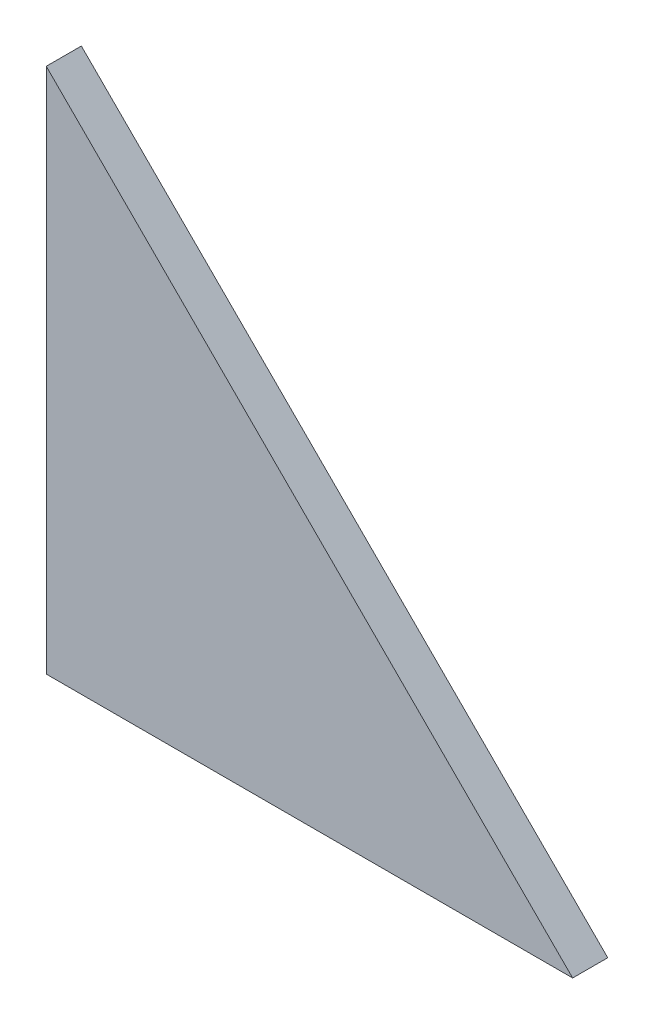
ISO-10303-21;
HEADER;
FILE_DESCRIPTION(('STEP AP214'),'2;1');
FILE_NAME('part.step','',(''),(''),'','','');
FILE_SCHEMA(('AUTOMOTIVE_DESIGN { 1 0 10303 214 1 1 1 1 }'));
ENDSEC;
DATA;
#1=APPLICATION_CONTEXT('core data for automotive mechanical design processes');
#2=APPLICATION_PROTOCOL_DEFINITION('international standard','automotive_design',2000,#1);
#3=PRODUCT_CONTEXT('',#1,'mechanical');
#4=PRODUCT('Part','Part','',(#3));
#5=PRODUCT_RELATED_PRODUCT_CATEGORY('part','',(#4));
#6=PRODUCT_DEFINITION_FORMATION('','',#4);
#7=PRODUCT_DEFINITION_CONTEXT('part definition',#1,'design');
#8=PRODUCT_DEFINITION('design','',#6,#7);
#9=PRODUCT_DEFINITION_SHAPE('','',#8);
#10=(LENGTH_UNIT() NAMED_UNIT(*) SI_UNIT(.MILLI.,.METRE.));
#11=(NAMED_UNIT(*) PLANE_ANGLE_UNIT() SI_UNIT($,.RADIAN.));
#12=(NAMED_UNIT(*) SI_UNIT($,.STERADIAN.) SOLID_ANGLE_UNIT());
#13=UNCERTAINTY_MEASURE_WITH_UNIT(LENGTH_MEASURE(1.E-05),#10,'distance_accuracy_value','');
#14=(GEOMETRIC_REPRESENTATION_CONTEXT(3) GLOBAL_UNCERTAINTY_ASSIGNED_CONTEXT((#13)) GLOBAL_UNIT_ASSIGNED_CONTEXT((#10,
#11,#12)) REPRESENTATION_CONTEXT('',''));
#15=CARTESIAN_POINT('',(0.,0.,0.));
#16=DIRECTION('',(0.,0.,1.));
#17=DIRECTION('',(1.,0.,0.));
#18=AXIS2_PLACEMENT_3D('',#15,#16,#17);
#19=CARTESIAN_POINT('',(123.891137895932,-23.2042056074766,10.));
#20=DIRECTION('',(-0.707106781186551,-0.707106781186544,0.));
#21=DIRECTION('',(0.707106781186544,-0.707106781186551,0.));
#22=AXIS2_PLACEMENT_3D('',#19,#20,#21);
#23=PLANE('',#22);
#24=DIRECTION('',(-0.707106781186544,0.707106781186551,0.));
#25=VECTOR('',#24,1.);
#26=CARTESIAN_POINT('',(123.891137895932,-23.2042056074766,0.));
#27=LINE('',#26,#25);
#28=CARTESIAN_POINT('',(123.891137895932,-23.2042056074766,0.));
#29=VERTEX_POINT('',#28);
#30=CARTESIAN_POINT('',(-26.1088621040665,126.795794392523,0.));
#31=VERTEX_POINT('',#30);
#32=EDGE_CURVE('E85',#29,#31,#27,.T.);
#33=ORIENTED_EDGE('',*,*,#32,.T.);
#34=DIRECTION('',(0.,0.,-1.));
#35=VECTOR('',#34,1.);
#36=CARTESIAN_POINT('',(-26.1088621040665,126.795794392523,10.));
#37=LINE('',#36,#35);
#38=CARTESIAN_POINT('',(-26.1088621040665,126.795794392523,10.));
#39=VERTEX_POINT('',#38);
#40=EDGE_CURVE('E11',#39,#31,#37,.T.);
#41=ORIENTED_EDGE('',*,*,#40,.F.);
#42=DIRECTION('',(-0.707106781186544,0.707106781186551,0.));
#43=VECTOR('',#42,1.);
#44=CARTESIAN_POINT('',(123.891137895932,-23.2042056074766,10.));
#45=LINE('',#44,#43);
#46=CARTESIAN_POINT('',(123.891137895932,-23.2042056074766,10.));
#47=VERTEX_POINT('',#46);
#48=EDGE_CURVE('E78',#47,#39,#45,.T.);
#49=ORIENTED_EDGE('',*,*,#48,.F.);
#50=DIRECTION('',(0.,0.,-1.));
#51=VECTOR('',#50,1.);
#52=CARTESIAN_POINT('',(123.891137895932,-23.2042056074766,10.));
#53=LINE('',#52,#51);
#54=EDGE_CURVE('E86',#47,#29,#53,.T.);
#55=ORIENTED_EDGE('',*,*,#54,.T.);
#56=EDGE_LOOP('',(#33,#41,#49,#55));
#57=FACE_BOUND('',#56,.T.);
#58=ADVANCED_FACE('F38',(#57),#23,.F.);
#59=CARTESIAN_POINT('',(-26.1088621040665,126.795794392523,10.));
#60=DIRECTION('',(1.,0.,0.));
#61=DIRECTION('',(0.,1.,0.));
#62=AXIS2_PLACEMENT_3D('',#59,#60,#61);
#63=PLANE('',#62);
#64=DIRECTION('',(0.,-1.,0.));
#65=VECTOR('',#64,1.);
#66=CARTESIAN_POINT('',(-26.1088621040665,126.795794392523,0.));
#67=LINE('',#66,#65);
#68=CARTESIAN_POINT('',(-26.1088621040665,-23.2042056074766,0.));
#69=VERTEX_POINT('',#68);
#70=EDGE_CURVE('E66',#31,#69,#67,.T.);
#71=ORIENTED_EDGE('',*,*,#70,.T.);
#72=DIRECTION('',(0.,0.,-1.));
#73=VECTOR('',#72,1.);
#74=CARTESIAN_POINT('',(-26.1088621040665,-23.2042056074766,10.));
#75=LINE('',#74,#73);
#76=CARTESIAN_POINT('',(-26.1088621040665,-23.2042056074766,10.));
#77=VERTEX_POINT('',#76);
#78=EDGE_CURVE('E46',#77,#69,#75,.T.);
#79=ORIENTED_EDGE('',*,*,#78,.F.);
#80=DIRECTION('',(0.,-1.,0.));
#81=VECTOR('',#80,1.);
#82=CARTESIAN_POINT('',(-26.1088621040665,126.795794392523,10.));
#83=LINE('',#82,#81);
#84=EDGE_CURVE('E74',#39,#77,#83,.T.);
#85=ORIENTED_EDGE('',*,*,#84,.F.);
#86=ORIENTED_EDGE('',*,*,#40,.T.);
#87=EDGE_LOOP('',(#71,#79,#85,#86));
#88=FACE_BOUND('',#87,.T.);
#89=ADVANCED_FACE('F75',(#88),#63,.F.);
#90=CARTESIAN_POINT('',(-26.1088621040665,-23.2042056074766,10.));
#91=DIRECTION('',(0.,1.,0.));
#92=DIRECTION('',(0.,0.,1.));
#93=AXIS2_PLACEMENT_3D('',#90,#91,#92);
#94=PLANE('',#93);
#95=DIRECTION('',(1.,0.,0.));
#96=VECTOR('',#95,1.);
#97=CARTESIAN_POINT('',(-26.1088621040665,-23.2042056074766,0.));
#98=LINE('',#97,#96);
#99=EDGE_CURVE('E71',#69,#29,#98,.T.);
#100=ORIENTED_EDGE('',*,*,#99,.T.);
#101=ORIENTED_EDGE('',*,*,#54,.F.);
#102=DIRECTION('',(1.,0.,0.));
#103=VECTOR('',#102,1.);
#104=CARTESIAN_POINT('',(-26.1088621040665,-23.2042056074766,10.));
#105=LINE('',#104,#103);
#106=EDGE_CURVE('E54',#77,#47,#105,.T.);
#107=ORIENTED_EDGE('',*,*,#106,.F.);
#108=ORIENTED_EDGE('',*,*,#78,.T.);
#109=EDGE_LOOP('',(#100,#101,#107,#108));
#110=FACE_BOUND('',#109,.T.);
#111=ADVANCED_FACE('F93',(#110),#94,.F.);
#112=CARTESIAN_POINT('',(0.,0.,10.));
#113=DIRECTION('',(0.,0.,1.));
#114=DIRECTION('',(1.,0.,0.));
#115=AXIS2_PLACEMENT_3D('',#112,#113,#114);
#116=PLANE('',#115);
#117=ORIENTED_EDGE('',*,*,#48,.T.);
#118=ORIENTED_EDGE('',*,*,#84,.T.);
#119=ORIENTED_EDGE('',*,*,#106,.T.);
#120=EDGE_LOOP('',(#117,#118,#119));
#121=FACE_BOUND('',#120,.T.);
#122=ADVANCED_FACE('F81',(#121),#116,.T.);
#123=CARTESIAN_POINT('',(0.,0.,0.));
#124=DIRECTION('',(0.,0.,1.));
#125=DIRECTION('',(1.,0.,0.));
#126=AXIS2_PLACEMENT_3D('',#123,#124,#125);
#127=PLANE('',#126);
#128=ORIENTED_EDGE('',*,*,#32,.F.);
#129=ORIENTED_EDGE('',*,*,#99,.F.);
#130=ORIENTED_EDGE('',*,*,#70,.F.);
#131=EDGE_LOOP('',(#128,#129,#130));
#132=FACE_BOUND('',#131,.T.);
#133=ADVANCED_FACE('F94',(#132),#127,.F.);
#134=CLOSED_SHELL('',(#58,#89,#111,#122,#133));
#135=MANIFOLD_SOLID_BREP('B2',#134);
#136=ADVANCED_BREP_SHAPE_REPRESENTATION('',(#18,#135),#14);
#137=SHAPE_DEFINITION_REPRESENTATION(#9,#136);
ENDSEC;
END-ISO-10303-21;
